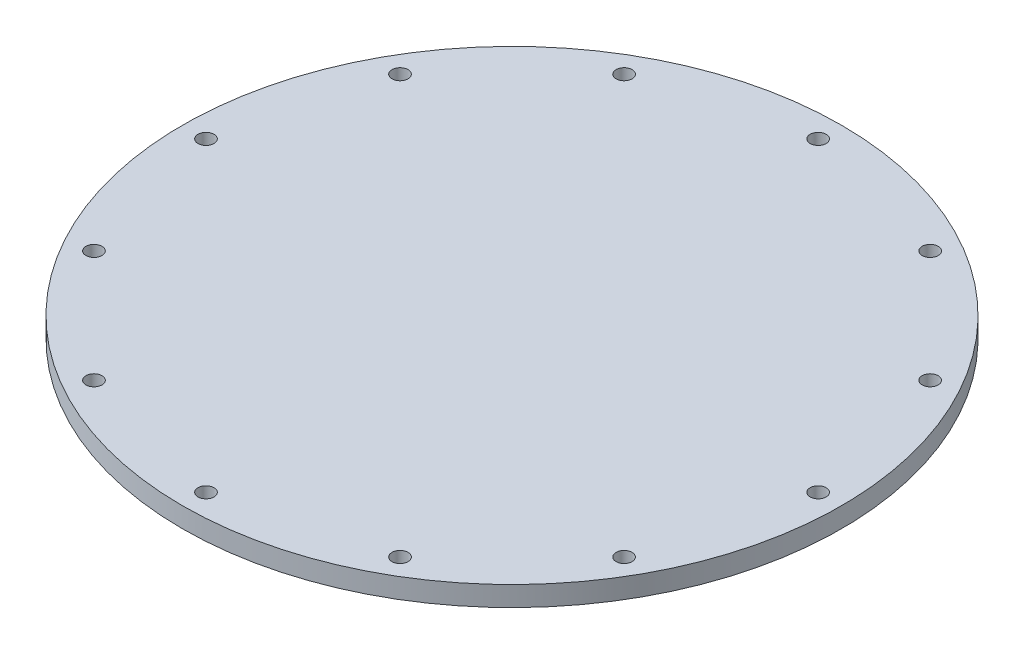
ISO-10303-21;
HEADER;
FILE_DESCRIPTION(('STEP AP214'),'2;1');
FILE_NAME('part.step','',(''),(''),'','','');
FILE_SCHEMA(('AUTOMOTIVE_DESIGN { 1 0 10303 214 1 1 1 1 }'));
ENDSEC;
DATA;
#1=APPLICATION_CONTEXT('core data for automotive mechanical design processes');
#2=APPLICATION_PROTOCOL_DEFINITION('international standard','automotive_design',2000,#1);
#3=PRODUCT_CONTEXT('',#1,'mechanical');
#4=PRODUCT('Part','Part','',(#3));
#5=PRODUCT_RELATED_PRODUCT_CATEGORY('part','',(#4));
#6=PRODUCT_DEFINITION_FORMATION('','',#4);
#7=PRODUCT_DEFINITION_CONTEXT('part definition',#1,'design');
#8=PRODUCT_DEFINITION('design','',#6,#7);
#9=PRODUCT_DEFINITION_SHAPE('','',#8);
#10=(LENGTH_UNIT() NAMED_UNIT(*) SI_UNIT(.MILLI.,.METRE.));
#11=(NAMED_UNIT(*) PLANE_ANGLE_UNIT() SI_UNIT($,.RADIAN.));
#12=(NAMED_UNIT(*) SI_UNIT($,.STERADIAN.) SOLID_ANGLE_UNIT());
#13=UNCERTAINTY_MEASURE_WITH_UNIT(LENGTH_MEASURE(1.E-05),#10,'distance_accuracy_value','');
#14=(GEOMETRIC_REPRESENTATION_CONTEXT(3) GLOBAL_UNCERTAINTY_ASSIGNED_CONTEXT((#13)) GLOBAL_UNIT_ASSIGNED_CONTEXT((#10,
#11,#12)) REPRESENTATION_CONTEXT('',''));
#15=CARTESIAN_POINT('',(0.,0.,0.));
#16=DIRECTION('',(0.,0.,1.));
#17=DIRECTION('',(1.,0.,0.));
#18=AXIS2_PLACEMENT_3D('',#15,#16,#17);
#19=CARTESIAN_POINT('',(0.,6.35,0.));
#20=DIRECTION('',(0.,-1.,0.));
#21=DIRECTION('',(0.,0.,-1.));
#22=AXIS2_PLACEMENT_3D('',#19,#20,#21);
#23=CYLINDRICAL_SURFACE('',#22,104.775);
#24=CARTESIAN_POINT('',(0.,6.35,0.));
#25=DIRECTION('',(0.,1.,0.));
#26=DIRECTION('',(0.,0.,1.));
#27=AXIS2_PLACEMENT_3D('',#24,#25,#26);
#28=CIRCLE('',#27,104.775);
#29=CARTESIAN_POINT('',(0.,6.35,104.775));
#30=VERTEX_POINT('',#29);
#31=EDGE_CURVE('E11',#30,#30,#28,.T.);
#32=ORIENTED_EDGE('',*,*,#31,.F.);
#33=EDGE_LOOP('',(#32));
#34=FACE_BOUND('',#33,.T.);
#35=CARTESIAN_POINT('',(0.,0.,0.));
#36=DIRECTION('',(0.,1.,0.));
#37=DIRECTION('',(0.,0.,1.));
#38=AXIS2_PLACEMENT_3D('',#35,#36,#37);
#39=CIRCLE('',#38,104.775);
#40=CARTESIAN_POINT('',(0.,0.,104.775));
#41=VERTEX_POINT('',#40);
#42=EDGE_CURVE('E51',#41,#41,#39,.T.);
#43=ORIENTED_EDGE('',*,*,#42,.T.);
#44=EDGE_LOOP('',(#43));
#45=FACE_BOUND('',#44,.T.);
#46=ADVANCED_FACE('F48',(#34,#45),#23,.T.);
#47=CARTESIAN_POINT('',(0.,6.35,0.));
#48=DIRECTION('',(0.,1.,0.));
#49=DIRECTION('',(0.,0.,1.));
#50=AXIS2_PLACEMENT_3D('',#47,#48,#49);
#51=PLANE('',#50);
#52=CARTESIAN_POINT('',(-97.2579884720799,6.35,0.0288803737274097));
#53=DIRECTION('',(0.,1.,0.));
#54=DIRECTION('',(0.500000000000001,0.,0.866025403784438));
#55=AXIS2_PLACEMENT_3D('',#52,#53,#54);
#56=CIRCLE('',#55,2.55269999999998);
#57=CARTESIAN_POINT('',(-95.9816384720799,6.35,2.23958342196793));
#58=VERTEX_POINT('',#57);
#59=EDGE_CURVE('E155',#58,#58,#56,.T.);
#60=ORIENTED_EDGE('',*,*,#59,.F.);
#61=EDGE_LOOP('',(#60));
#62=FACE_BOUND('',#61,.T.);
#63=CARTESIAN_POINT('',(-48.6039830978496,6.35,-84.2423289251619));
#64=DIRECTION('',(0.,1.,0.));
#65=DIRECTION('',(-0.499999999999989,0.,0.866025403784445));
#66=AXIS2_PLACEMENT_3D('',#63,#64,#65);
#67=CIRCLE('',#66,2.55269999999998);
#68=CARTESIAN_POINT('',(-49.8803330978495,6.35,-82.0316258769213));
#69=VERTEX_POINT('',#68);
#70=EDGE_CURVE('E134',#69,#69,#67,.T.);
#71=ORIENTED_EDGE('',*,*,#70,.F.);
#72=EDGE_LOOP('',(#71));
#73=FACE_BOUND('',#72,.T.);
#74=CARTESIAN_POINT('',(0.0500222760127566,6.35,-97.2791303733583));
#75=DIRECTION('',(0.,1.,0.));
#76=DIRECTION('',(-0.866025403784433,0.,0.50000000000001));
#77=AXIS2_PLACEMENT_3D('',#74,#75,#76);
#78=CIRCLE('',#77,2.55269999999998);
#79=CARTESIAN_POINT('',(-2.16068077222775,6.35,-96.0027803733582));
#80=VERTEX_POINT('',#79);
#81=EDGE_CURVE('E133',#80,#80,#78,.T.);
#82=ORIENTED_EDGE('',*,*,#81,.F.);
#83=EDGE_LOOP('',(#82));
#84=FACE_BOUND('',#83,.T.);
#85=CARTESIAN_POINT('',(-84.221187023884,6.35,48.6828857475899));
#86=DIRECTION('',(0.,1.,0.));
#87=DIRECTION('',(0.86602540378444,0.,0.499999999999998));
#88=AXIS2_PLACEMENT_3D('',#85,#86,#87);
#89=CIRCLE('',#88,2.55269999999998);
#90=CARTESIAN_POINT('',(-82.0104839756435,6.35,49.9592357475899));
#91=VERTEX_POINT('',#90);
#92=EDGE_CURVE('E179',#91,#91,#89,.T.);
#93=ORIENTED_EDGE('',*,*,#92,.F.);
#94=EDGE_LOOP('',(#93));
#95=FACE_BOUND('',#94,.T.);
#96=CARTESIAN_POINT('',(-48.6039830987213,6.35,84.3000896731213));
#97=DIRECTION('',(0.,1.,0.));
#98=DIRECTION('',(1.,0.,0.));
#99=AXIS2_PLACEMENT_3D('',#96,#97,#98);
#100=CIRCLE('',#99,2.55269999999998);
#101=CARTESIAN_POINT('',(-46.0512830987213,6.35,84.3000896731213));
#102=VERTEX_POINT('',#101);
#103=EDGE_CURVE('E187',#102,#102,#100,.T.);
#104=ORIENTED_EDGE('',*,*,#103,.F.);
#105=EDGE_LOOP('',(#104));
#106=FACE_BOUND('',#105,.T.);
#107=CARTESIAN_POINT('',(0.0500222750061157,6.35,97.3368911218211));
#108=DIRECTION('',(0.,1.,0.));
#109=DIRECTION('',(0.866025403784436,0.,-0.500000000000004));
#110=AXIS2_PLACEMENT_3D('',#107,#108,#109);
#111=CIRCLE('',#110,2.55269999999998);
#112=CARTESIAN_POINT('',(2.26072532324663,6.35,96.0605411218211));
#113=VERTEX_POINT('',#112);
#114=EDGE_CURVE('E114',#113,#113,#111,.T.);
#115=ORIENTED_EDGE('',*,*,#114,.F.);
#116=EDGE_LOOP('',(#115));
#117=FACE_BOUND('',#116,.T.);
#118=CARTESIAN_POINT('',(48.7040276488685,6.35,84.300089673625));
#119=DIRECTION('',(0.,1.,0.));
#120=DIRECTION('',(0.499999999999995,0.,-0.866025403784442));
#121=AXIS2_PLACEMENT_3D('',#118,#119,#120);
#122=CIRCLE('',#121,2.55269999999998);
#123=CARTESIAN_POINT('',(49.9803776488685,6.35,82.0893866253845));
#124=VERTEX_POINT('',#123);
#125=EDGE_CURVE('E96',#124,#124,#122,.T.);
#126=ORIENTED_EDGE('',*,*,#125,.F.);
#127=EDGE_LOOP('',(#126));
#128=FACE_BOUND('',#127,.T.);
#129=CARTESIAN_POINT('',(84.3212315743995,6.35,48.6828857484628));
#130=DIRECTION('',(0.,1.,0.));
#131=DIRECTION('',(0.,0.,-1.));
#132=AXIS2_PLACEMENT_3D('',#129,#130,#131);
#133=CIRCLE('',#132,2.55269999999998);
#134=CARTESIAN_POINT('',(84.3212315743995,6.35,46.1301857484628));
#135=VERTEX_POINT('',#134);
#136=EDGE_CURVE('E124',#135,#135,#133,.T.);
#137=ORIENTED_EDGE('',*,*,#136,.F.);
#138=EDGE_LOOP('',(#137));
#139=FACE_BOUND('',#138,.T.);
#140=CARTESIAN_POINT('',(97.3580330230995,6.35,0.0288803747347241));
#141=DIRECTION('',(0.,1.,0.));
#142=DIRECTION('',(-0.500000000000007,0.,-0.866025403784435));
#143=AXIS2_PLACEMENT_3D('',#140,#141,#142);
#144=CIRCLE('',#143,2.55269999999998);
#145=CARTESIAN_POINT('',(96.0816830230994,6.35,-2.18182267350579));
#146=VERTEX_POINT('',#145);
#147=EDGE_CURVE('E81',#146,#146,#144,.T.);
#148=ORIENTED_EDGE('',*,*,#147,.F.);
#149=EDGE_LOOP('',(#148));
#150=FACE_BOUND('',#149,.T.);
#151=CARTESIAN_POINT('',(84.3212315749032,6.35,-48.6251249991276));
#152=DIRECTION('',(0.,1.,0.));
#153=DIRECTION('',(-0.866025403784443,0.,-0.499999999999992));
#154=AXIS2_PLACEMENT_3D('',#151,#152,#153);
#155=CIRCLE('',#154,2.55269999999998);
#156=CARTESIAN_POINT('',(82.1105285266627,6.35,-49.9014749991276));
#157=VERTEX_POINT('',#156);
#158=EDGE_CURVE('E178',#157,#157,#155,.T.);
#159=ORIENTED_EDGE('',*,*,#158,.F.);
#160=EDGE_LOOP('',(#159));
#161=FACE_BOUND('',#160,.T.);
#162=CARTESIAN_POINT('',(48.7040276497403,6.35,-84.2423289246589));
#163=DIRECTION('',(0.,1.,0.));
#164=DIRECTION('',(-1.,0.,0.));
#165=AXIS2_PLACEMENT_3D('',#162,#163,#164);
#166=CIRCLE('',#165,2.55269999999998);
#167=CARTESIAN_POINT('',(46.1513276497403,6.35,-84.2423289246588));
#168=VERTEX_POINT('',#167);
#169=EDGE_CURVE('E170',#168,#168,#166,.T.);
#170=ORIENTED_EDGE('',*,*,#169,.F.);
#171=EDGE_LOOP('',(#170));
#172=FACE_BOUND('',#171,.T.);
#173=CARTESIAN_POINT('',(-84.22118702338,6.35,-48.625125));
#174=DIRECTION('',(0.,1.,0.));
#175=DIRECTION('',(0.,0.,1.));
#176=AXIS2_PLACEMENT_3D('',#173,#174,#175);
#177=CIRCLE('',#176,2.55269999999998);
#178=CARTESIAN_POINT('',(-84.22118702338,6.35,-46.072425));
#179=VERTEX_POINT('',#178);
#180=EDGE_CURVE('E148',#179,#179,#177,.T.);
#181=ORIENTED_EDGE('',*,*,#180,.F.);
#182=EDGE_LOOP('',(#181));
#183=FACE_BOUND('',#182,.T.);
#184=ORIENTED_EDGE('',*,*,#31,.T.);
#185=EDGE_LOOP('',(#184));
#186=FACE_BOUND('',#185,.T.);
#187=ADVANCED_FACE('F206',(#62,#73,#84,#95,#106,#117,#128,#139,#150,#161,#172,#183,#186),#51,.T.);
#188=CARTESIAN_POINT('',(0.,0.,0.));
#189=DIRECTION('',(0.,1.,0.));
#190=DIRECTION('',(0.,0.,1.));
#191=AXIS2_PLACEMENT_3D('',#188,#189,#190);
#192=PLANE('',#191);
#193=CARTESIAN_POINT('',(-97.2579884720799,0.,0.0288803737274097));
#194=DIRECTION('',(0.,1.,0.));
#195=DIRECTION('',(0.,0.,1.));
#196=AXIS2_PLACEMENT_3D('',#193,#194,#195);
#197=CIRCLE('',#196,2.55269999999998);
#198=CARTESIAN_POINT('',(-97.2579884720799,0.,2.58158037372739));
#199=VERTEX_POINT('',#198);
#200=EDGE_CURVE('E152',#199,#199,#197,.F.);
#201=ORIENTED_EDGE('',*,*,#200,.F.);
#202=EDGE_LOOP('',(#201));
#203=FACE_BOUND('',#202,.T.);
#204=CARTESIAN_POINT('',(-48.6039830978496,0.,-84.2423289251619));
#205=DIRECTION('',(0.,1.,0.));
#206=DIRECTION('',(0.,0.,1.));
#207=AXIS2_PLACEMENT_3D('',#204,#205,#206);
#208=CIRCLE('',#207,2.55269999999998);
#209=CARTESIAN_POINT('',(-48.6039830978496,0.,-81.6896289251619));
#210=VERTEX_POINT('',#209);
#211=EDGE_CURVE('E129',#210,#210,#208,.F.);
#212=ORIENTED_EDGE('',*,*,#211,.F.);
#213=EDGE_LOOP('',(#212));
#214=FACE_BOUND('',#213,.T.);
#215=CARTESIAN_POINT('',(0.0500222760127566,0.,-97.2791303733583));
#216=DIRECTION('',(0.,1.,0.));
#217=DIRECTION('',(0.,0.,1.));
#218=AXIS2_PLACEMENT_3D('',#215,#216,#217);
#219=CIRCLE('',#218,2.55269999999998);
#220=CARTESIAN_POINT('',(0.0500222760127566,0.,-94.7264303733583));
#221=VERTEX_POINT('',#220);
#222=EDGE_CURVE('E139',#221,#221,#219,.F.);
#223=ORIENTED_EDGE('',*,*,#222,.F.);
#224=EDGE_LOOP('',(#223));
#225=FACE_BOUND('',#224,.T.);
#226=CARTESIAN_POINT('',(-84.221187023884,0.,48.6828857475899));
#227=DIRECTION('',(0.,1.,0.));
#228=DIRECTION('',(0.,0.,1.));
#229=AXIS2_PLACEMENT_3D('',#226,#227,#228);
#230=CIRCLE('',#229,2.55269999999998);
#231=CARTESIAN_POINT('',(-84.221187023884,0.,51.2355857475899));
#232=VERTEX_POINT('',#231);
#233=EDGE_CURVE('E160',#232,#232,#230,.F.);
#234=ORIENTED_EDGE('',*,*,#233,.F.);
#235=EDGE_LOOP('',(#234));
#236=FACE_BOUND('',#235,.T.);
#237=CARTESIAN_POINT('',(-48.6039830987213,0.,84.3000896731213));
#238=DIRECTION('',(0.,1.,0.));
#239=DIRECTION('',(0.,0.,1.));
#240=AXIS2_PLACEMENT_3D('',#237,#238,#239);
#241=CIRCLE('',#240,2.55269999999998);
#242=CARTESIAN_POINT('',(-48.6039830987213,0.,86.8527896731213));
#243=VERTEX_POINT('',#242);
#244=EDGE_CURVE('E119',#243,#243,#241,.F.);
#245=ORIENTED_EDGE('',*,*,#244,.F.);
#246=EDGE_LOOP('',(#245));
#247=FACE_BOUND('',#246,.T.);
#248=CARTESIAN_POINT('',(0.0500222750061157,0.,97.3368911218211));
#249=DIRECTION('',(0.,1.,0.));
#250=DIRECTION('',(0.,0.,1.));
#251=AXIS2_PLACEMENT_3D('',#248,#249,#250);
#252=CIRCLE('',#251,2.55269999999998);
#253=CARTESIAN_POINT('',(0.0500222750061157,0.,99.8895911218211));
#254=VERTEX_POINT('',#253);
#255=EDGE_CURVE('E103',#254,#254,#252,.F.);
#256=ORIENTED_EDGE('',*,*,#255,.F.);
#257=EDGE_LOOP('',(#256));
#258=FACE_BOUND('',#257,.T.);
#259=CARTESIAN_POINT('',(48.7040276488685,0.,84.300089673625));
#260=DIRECTION('',(0.,1.,0.));
#261=DIRECTION('',(0.,0.,1.));
#262=AXIS2_PLACEMENT_3D('',#259,#260,#261);
#263=CIRCLE('',#262,2.55269999999998);
#264=CARTESIAN_POINT('',(48.7040276488685,0.,86.852789673625));
#265=VERTEX_POINT('',#264);
#266=EDGE_CURVE('E102',#265,#265,#263,.F.);
#267=ORIENTED_EDGE('',*,*,#266,.F.);
#268=EDGE_LOOP('',(#267));
#269=FACE_BOUND('',#268,.T.);
#270=CARTESIAN_POINT('',(84.3212315743995,0.,48.6828857484628));
#271=DIRECTION('',(0.,1.,0.));
#272=DIRECTION('',(0.,0.,1.));
#273=AXIS2_PLACEMENT_3D('',#270,#271,#272);
#274=CIRCLE('',#273,2.55269999999998);
#275=CARTESIAN_POINT('',(84.3212315743995,0.,51.2355857484628));
#276=VERTEX_POINT('',#275);
#277=EDGE_CURVE('E89',#276,#276,#274,.F.);
#278=ORIENTED_EDGE('',*,*,#277,.F.);
#279=EDGE_LOOP('',(#278));
#280=FACE_BOUND('',#279,.T.);
#281=CARTESIAN_POINT('',(97.3580330230995,0.,0.0288803747347241));
#282=DIRECTION('',(0.,1.,0.));
#283=DIRECTION('',(0.,0.,1.));
#284=AXIS2_PLACEMENT_3D('',#281,#282,#283);
#285=CIRCLE('',#284,2.55269999999998);
#286=CARTESIAN_POINT('',(97.3580330230995,0.,2.58158037473471));
#287=VERTEX_POINT('',#286);
#288=EDGE_CURVE('E87',#287,#287,#285,.F.);
#289=ORIENTED_EDGE('',*,*,#288,.F.);
#290=EDGE_LOOP('',(#289));
#291=FACE_BOUND('',#290,.T.);
#292=CARTESIAN_POINT('',(84.3212315749032,0.,-48.6251249991276));
#293=DIRECTION('',(0.,1.,0.));
#294=DIRECTION('',(0.,0.,1.));
#295=AXIS2_PLACEMENT_3D('',#292,#293,#294);
#296=CIRCLE('',#295,2.55269999999998);
#297=CARTESIAN_POINT('',(84.3212315749032,0.,-46.0724249991276));
#298=VERTEX_POINT('',#297);
#299=EDGE_CURVE('E88',#298,#298,#296,.F.);
#300=ORIENTED_EDGE('',*,*,#299,.F.);
#301=EDGE_LOOP('',(#300));
#302=FACE_BOUND('',#301,.T.);
#303=CARTESIAN_POINT('',(48.7040276497403,0.,-84.2423289246589));
#304=DIRECTION('',(0.,1.,0.));
#305=DIRECTION('',(0.,0.,1.));
#306=AXIS2_PLACEMENT_3D('',#303,#304,#305);
#307=CIRCLE('',#306,2.55269999999998);
#308=CARTESIAN_POINT('',(48.7040276497403,0.,-81.6896289246589));
#309=VERTEX_POINT('',#308);
#310=EDGE_CURVE('E175',#309,#309,#307,.F.);
#311=ORIENTED_EDGE('',*,*,#310,.F.);
#312=EDGE_LOOP('',(#311));
#313=FACE_BOUND('',#312,.T.);
#314=CARTESIAN_POINT('',(-84.22118702338,0.,-48.625125));
#315=DIRECTION('',(0.,1.,0.));
#316=DIRECTION('',(0.,0.,1.));
#317=AXIS2_PLACEMENT_3D('',#314,#315,#316);
#318=CIRCLE('',#317,2.55269999999998);
#319=CARTESIAN_POINT('',(-84.22118702338,0.,-46.072425));
#320=VERTEX_POINT('',#319);
#321=EDGE_CURVE('E63',#320,#320,#318,.F.);
#322=ORIENTED_EDGE('',*,*,#321,.F.);
#323=EDGE_LOOP('',(#322));
#324=FACE_BOUND('',#323,.T.);
#325=ORIENTED_EDGE('',*,*,#42,.F.);
#326=EDGE_LOOP('',(#325));
#327=FACE_BOUND('',#326,.T.);
#328=ADVANCED_FACE('F202',(#203,#214,#225,#236,#247,#258,#269,#280,#291,#302,#313,#324,#327),
#192,.F.);
#329=CARTESIAN_POINT('',(-84.22118702338,-7.22012592133954,-48.625125));
#330=DIRECTION('',(0.,1.,0.));
#331=DIRECTION('',(0.,0.,1.));
#332=AXIS2_PLACEMENT_3D('',#329,#330,#331);
#333=CYLINDRICAL_SURFACE('',#332,2.55269999999998);
#334=ORIENTED_EDGE('',*,*,#321,.T.);
#335=EDGE_LOOP('',(#334));
#336=FACE_BOUND('',#335,.T.);
#337=ORIENTED_EDGE('',*,*,#180,.T.);
#338=EDGE_LOOP('',(#337));
#339=FACE_BOUND('',#338,.T.);
#340=ADVANCED_FACE('F205',(#336,#339),#333,.F.);
#341=CARTESIAN_POINT('',(48.7040276497403,-7.22012592133954,-84.2423289246589));
#342=DIRECTION('',(0.,1.,0.));
#343=DIRECTION('',(0.,0.,1.));
#344=AXIS2_PLACEMENT_3D('',#341,#342,#343);
#345=CYLINDRICAL_SURFACE('',#344,2.55269999999998);
#346=ORIENTED_EDGE('',*,*,#310,.T.);
#347=EDGE_LOOP('',(#346));
#348=FACE_BOUND('',#347,.T.);
#349=ORIENTED_EDGE('',*,*,#169,.T.);
#350=EDGE_LOOP('',(#349));
#351=FACE_BOUND('',#350,.T.);
#352=ADVANCED_FACE('F241',(#348,#351),#345,.F.);
#353=CARTESIAN_POINT('',(84.3212315749032,-7.22012592133954,-48.6251249991276));
#354=DIRECTION('',(0.,1.,0.));
#355=DIRECTION('',(0.,0.,1.));
#356=AXIS2_PLACEMENT_3D('',#353,#354,#355);
#357=CYLINDRICAL_SURFACE('',#356,2.55269999999998);
#358=ORIENTED_EDGE('',*,*,#299,.T.);
#359=EDGE_LOOP('',(#358));
#360=FACE_BOUND('',#359,.T.);
#361=ORIENTED_EDGE('',*,*,#158,.T.);
#362=EDGE_LOOP('',(#361));
#363=FACE_BOUND('',#362,.T.);
#364=ADVANCED_FACE('F261',(#360,#363),#357,.F.);
#365=CARTESIAN_POINT('',(97.3580330230995,-7.22012592133954,0.0288803747347241));
#366=DIRECTION('',(0.,1.,0.));
#367=DIRECTION('',(0.,0.,1.));
#368=AXIS2_PLACEMENT_3D('',#365,#366,#367);
#369=CYLINDRICAL_SURFACE('',#368,2.55269999999998);
#370=ORIENTED_EDGE('',*,*,#288,.T.);
#371=EDGE_LOOP('',(#370));
#372=FACE_BOUND('',#371,.T.);
#373=ORIENTED_EDGE('',*,*,#147,.T.);
#374=EDGE_LOOP('',(#373));
#375=FACE_BOUND('',#374,.T.);
#376=ADVANCED_FACE('F265',(#372,#375),#369,.F.);
#377=CARTESIAN_POINT('',(84.3212315743995,-7.22012592133954,48.6828857484628));
#378=DIRECTION('',(0.,1.,0.));
#379=DIRECTION('',(0.,0.,1.));
#380=AXIS2_PLACEMENT_3D('',#377,#378,#379);
#381=CYLINDRICAL_SURFACE('',#380,2.55269999999998);
#382=ORIENTED_EDGE('',*,*,#277,.T.);
#383=EDGE_LOOP('',(#382));
#384=FACE_BOUND('',#383,.T.);
#385=ORIENTED_EDGE('',*,*,#136,.T.);
#386=EDGE_LOOP('',(#385));
#387=FACE_BOUND('',#386,.T.);
#388=ADVANCED_FACE('F246',(#384,#387),#381,.F.);
#389=CARTESIAN_POINT('',(48.7040276488685,-7.22012592133954,84.300089673625));
#390=DIRECTION('',(0.,1.,0.));
#391=DIRECTION('',(0.,0.,1.));
#392=AXIS2_PLACEMENT_3D('',#389,#390,#391);
#393=CYLINDRICAL_SURFACE('',#392,2.55269999999998);
#394=ORIENTED_EDGE('',*,*,#266,.T.);
#395=EDGE_LOOP('',(#394));
#396=FACE_BOUND('',#395,.T.);
#397=ORIENTED_EDGE('',*,*,#125,.T.);
#398=EDGE_LOOP('',(#397));
#399=FACE_BOUND('',#398,.T.);
#400=ADVANCED_FACE('F243',(#396,#399),#393,.F.);
#401=CARTESIAN_POINT('',(0.0500222750061157,-7.22012592133954,97.3368911218211));
#402=DIRECTION('',(0.,1.,0.));
#403=DIRECTION('',(0.,0.,1.));
#404=AXIS2_PLACEMENT_3D('',#401,#402,#403);
#405=CYLINDRICAL_SURFACE('',#404,2.55269999999998);
#406=ORIENTED_EDGE('',*,*,#255,.T.);
#407=EDGE_LOOP('',(#406));
#408=FACE_BOUND('',#407,.T.);
#409=ORIENTED_EDGE('',*,*,#114,.T.);
#410=EDGE_LOOP('',(#409));
#411=FACE_BOUND('',#410,.T.);
#412=ADVANCED_FACE('F199',(#408,#411),#405,.F.);
#413=CARTESIAN_POINT('',(-48.6039830987213,-7.22012592133954,84.3000896731213));
#414=DIRECTION('',(0.,1.,0.));
#415=DIRECTION('',(0.,0.,1.));
#416=AXIS2_PLACEMENT_3D('',#413,#414,#415);
#417=CYLINDRICAL_SURFACE('',#416,2.55269999999998);
#418=ORIENTED_EDGE('',*,*,#244,.T.);
#419=EDGE_LOOP('',(#418));
#420=FACE_BOUND('',#419,.T.);
#421=ORIENTED_EDGE('',*,*,#103,.T.);
#422=EDGE_LOOP('',(#421));
#423=FACE_BOUND('',#422,.T.);
#424=ADVANCED_FACE('F250',(#420,#423),#417,.F.);
#425=CARTESIAN_POINT('',(-84.221187023884,-7.22012592133954,48.6828857475899));
#426=DIRECTION('',(0.,1.,0.));
#427=DIRECTION('',(0.,0.,1.));
#428=AXIS2_PLACEMENT_3D('',#425,#426,#427);
#429=CYLINDRICAL_SURFACE('',#428,2.55269999999998);
#430=ORIENTED_EDGE('',*,*,#233,.T.);
#431=EDGE_LOOP('',(#430));
#432=FACE_BOUND('',#431,.T.);
#433=ORIENTED_EDGE('',*,*,#92,.T.);
#434=EDGE_LOOP('',(#433));
#435=FACE_BOUND('',#434,.T.);
#436=ADVANCED_FACE('F253',(#432,#435),#429,.F.);
#437=CARTESIAN_POINT('',(0.0500222760127566,-7.22012592133954,-97.2791303733583));
#438=DIRECTION('',(0.,1.,0.));
#439=DIRECTION('',(0.,0.,1.));
#440=AXIS2_PLACEMENT_3D('',#437,#438,#439);
#441=CYLINDRICAL_SURFACE('',#440,2.55269999999998);
#442=ORIENTED_EDGE('',*,*,#222,.T.);
#443=EDGE_LOOP('',(#442));
#444=FACE_BOUND('',#443,.T.);
#445=ORIENTED_EDGE('',*,*,#81,.T.);
#446=EDGE_LOOP('',(#445));
#447=FACE_BOUND('',#446,.T.);
#448=ADVANCED_FACE('F257',(#444,#447),#441,.F.);
#449=CARTESIAN_POINT('',(-48.6039830978496,-7.22012592133954,-84.2423289251619));
#450=DIRECTION('',(0.,1.,0.));
#451=DIRECTION('',(0.,0.,1.));
#452=AXIS2_PLACEMENT_3D('',#449,#450,#451);
#453=CYLINDRICAL_SURFACE('',#452,2.55269999999998);
#454=ORIENTED_EDGE('',*,*,#211,.T.);
#455=EDGE_LOOP('',(#454));
#456=FACE_BOUND('',#455,.T.);
#457=ORIENTED_EDGE('',*,*,#70,.T.);
#458=EDGE_LOOP('',(#457));
#459=FACE_BOUND('',#458,.T.);
#460=ADVANCED_FACE('F273',(#456,#459),#453,.F.);
#461=CARTESIAN_POINT('',(-97.2579884720799,-7.22012592133954,0.0288803737274097));
#462=DIRECTION('',(0.,1.,0.));
#463=DIRECTION('',(0.,0.,1.));
#464=AXIS2_PLACEMENT_3D('',#461,#462,#463);
#465=CYLINDRICAL_SURFACE('',#464,2.55269999999998);
#466=ORIENTED_EDGE('',*,*,#200,.T.);
#467=EDGE_LOOP('',(#466));
#468=FACE_BOUND('',#467,.T.);
#469=ORIENTED_EDGE('',*,*,#59,.T.);
#470=EDGE_LOOP('',(#469));
#471=FACE_BOUND('',#470,.T.);
#472=ADVANCED_FACE('F276',(#468,#471),#465,.F.);
#473=CLOSED_SHELL('',(#46,#187,#328,#340,#352,#364,#376,#388,#400,#412,#424,#436,#448,#460,#472));
#474=MANIFOLD_SOLID_BREP('B2',#473);
#475=ADVANCED_BREP_SHAPE_REPRESENTATION('',(#18,#474),#14);
#476=SHAPE_DEFINITION_REPRESENTATION(#9,#475);
ENDSEC;
END-ISO-10303-21;
